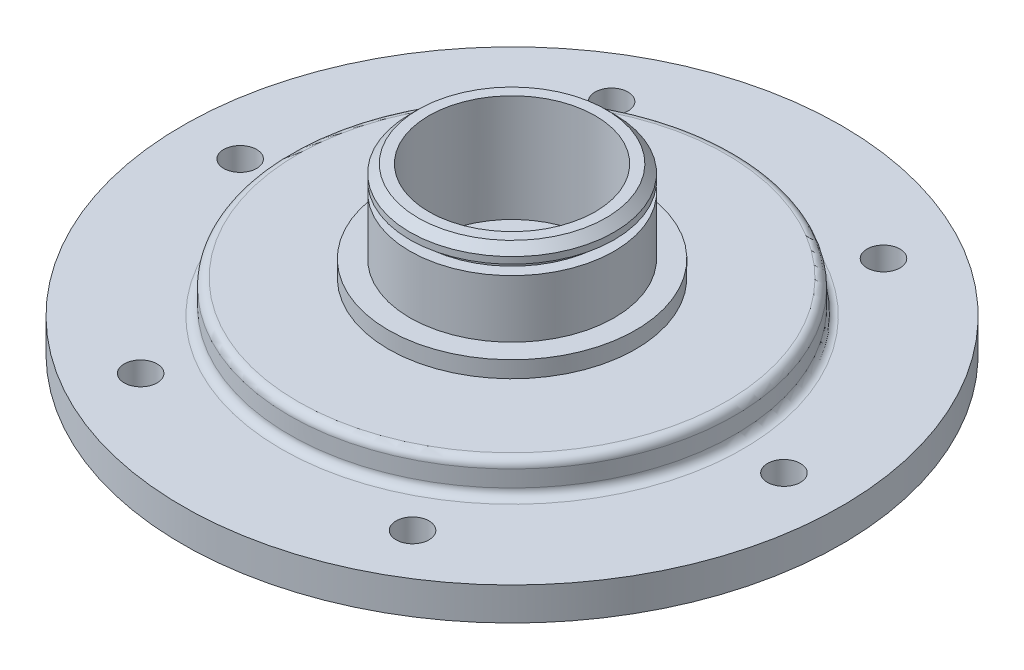
ISO-10303-21;
HEADER;
FILE_DESCRIPTION(('STEP AP214'),'2;1');
FILE_NAME('part.step','',(''),(''),'','','');
FILE_SCHEMA(('AUTOMOTIVE_DESIGN { 1 0 10303 214 1 1 1 1 }'));
ENDSEC;
DATA;
#1=APPLICATION_CONTEXT('core data for automotive mechanical design processes');
#2=APPLICATION_PROTOCOL_DEFINITION('international standard','automotive_design',2000,#1);
#3=PRODUCT_CONTEXT('',#1,'mechanical');
#4=PRODUCT('Part','Part','',(#3));
#5=PRODUCT_RELATED_PRODUCT_CATEGORY('part','',(#4));
#6=PRODUCT_DEFINITION_FORMATION('','',#4);
#7=PRODUCT_DEFINITION_CONTEXT('part definition',#1,'design');
#8=PRODUCT_DEFINITION('design','',#6,#7);
#9=PRODUCT_DEFINITION_SHAPE('','',#8);
#10=(LENGTH_UNIT() NAMED_UNIT(*) SI_UNIT(.MILLI.,.METRE.));
#11=(NAMED_UNIT(*) PLANE_ANGLE_UNIT() SI_UNIT($,.RADIAN.));
#12=(NAMED_UNIT(*) SI_UNIT($,.STERADIAN.) SOLID_ANGLE_UNIT());
#13=UNCERTAINTY_MEASURE_WITH_UNIT(LENGTH_MEASURE(1.E-05),#10,'distance_accuracy_value','');
#14=(GEOMETRIC_REPRESENTATION_CONTEXT(3) GLOBAL_UNCERTAINTY_ASSIGNED_CONTEXT((#13)) GLOBAL_UNIT_ASSIGNED_CONTEXT((#10,
#11,#12)) REPRESENTATION_CONTEXT('',''));
#15=CARTESIAN_POINT('',(0.,0.,0.));
#16=DIRECTION('',(0.,0.,1.));
#17=DIRECTION('',(1.,0.,0.));
#18=AXIS2_PLACEMENT_3D('',#15,#16,#17);
#19=CARTESIAN_POINT('',(0.,10.,0.));
#20=DIRECTION('',(0.,-1.,0.));
#21=DIRECTION('',(0.,0.,-1.));
#22=AXIS2_PLACEMENT_3D('',#19,#20,#21);
#23=CYLINDRICAL_SURFACE('',#22,10.1);
#24=CARTESIAN_POINT('',(0.,10.,0.));
#25=DIRECTION('',(0.,1.,0.));
#26=DIRECTION('',(0.,0.,1.));
#27=AXIS2_PLACEMENT_3D('',#24,#25,#26);
#28=CIRCLE('',#27,10.1);
#29=CARTESIAN_POINT('',(0.,10.,10.1));
#30=VERTEX_POINT('',#29);
#31=EDGE_CURVE('E83',#30,#30,#28,.T.);
#32=ORIENTED_EDGE('',*,*,#31,.T.);
#33=EDGE_LOOP('',(#32));
#34=FACE_BOUND('',#33,.T.);
#35=CARTESIAN_POINT('',(0.,-3.,0.));
#36=DIRECTION('',(0.,-1.,0.));
#37=DIRECTION('',(0.,0.,-1.));
#38=AXIS2_PLACEMENT_3D('',#35,#36,#37);
#39=CIRCLE('',#38,10.1);
#40=CARTESIAN_POINT('',(0.,-3.,-10.1));
#41=VERTEX_POINT('',#40);
#42=EDGE_CURVE('E68',#41,#41,#39,.T.);
#43=ORIENTED_EDGE('',*,*,#42,.T.);
#44=EDGE_LOOP('',(#43));
#45=FACE_BOUND('',#44,.T.);
#46=ADVANCED_FACE('F43',(#34,#45),#23,.F.);
#47=CARTESIAN_POINT('',(0.,10.,0.));
#48=DIRECTION('',(0.,-1.,0.));
#49=DIRECTION('',(0.,0.,-1.));
#50=AXIS2_PLACEMENT_3D('',#47,#48,#49);
#51=CYLINDRICAL_SURFACE('',#50,12.4);
#52=CARTESIAN_POINT('',(0.,0.,0.));
#53=DIRECTION('',(0.,1.,0.));
#54=DIRECTION('',(0.,0.,1.));
#55=AXIS2_PLACEMENT_3D('',#52,#53,#54);
#56=CIRCLE('',#55,12.4);
#57=CARTESIAN_POINT('',(0.,0.,12.4));
#58=VERTEX_POINT('',#57);
#59=EDGE_CURVE('E84',#58,#58,#56,.T.);
#60=ORIENTED_EDGE('',*,*,#59,.T.);
#61=EDGE_LOOP('',(#60));
#62=FACE_BOUND('',#61,.T.);
#63=CARTESIAN_POINT('',(0.,7.,0.));
#64=DIRECTION('',(0.,1.,0.));
#65=DIRECTION('',(0.,0.,1.));
#66=AXIS2_PLACEMENT_3D('',#63,#64,#65);
#67=CIRCLE('',#66,12.4);
#68=CARTESIAN_POINT('',(0.,7.,12.4));
#69=VERTEX_POINT('',#68);
#70=EDGE_CURVE('E135',#69,#69,#67,.T.);
#71=ORIENTED_EDGE('',*,*,#70,.F.);
#72=EDGE_LOOP('',(#71));
#73=FACE_BOUND('',#72,.T.);
#74=ADVANCED_FACE('F181',(#62,#73),#51,.T.);
#75=CARTESIAN_POINT('',(0.,10.,0.));
#76=DIRECTION('',(0.,1.,0.));
#77=DIRECTION('',(0.,0.,1.));
#78=AXIS2_PLACEMENT_3D('',#75,#76,#77);
#79=PLANE('',#78);
#80=CARTESIAN_POINT('',(0.,10.,0.));
#81=DIRECTION('',(0.,1.,0.));
#82=DIRECTION('',(0.,0.,1.));
#83=AXIS2_PLACEMENT_3D('',#80,#81,#82);
#84=CIRCLE('',#83,11.4);
#85=CARTESIAN_POINT('',(0.,10.,11.4));
#86=VERTEX_POINT('',#85);
#87=EDGE_CURVE('E80',#86,#86,#84,.T.);
#88=ORIENTED_EDGE('',*,*,#87,.T.);
#89=EDGE_LOOP('',(#88));
#90=FACE_BOUND('',#89,.T.);
#91=ORIENTED_EDGE('',*,*,#31,.F.);
#92=EDGE_LOOP('',(#91));
#93=FACE_BOUND('',#92,.T.);
#94=ADVANCED_FACE('F187',(#90,#93),#79,.T.);
#95=CARTESIAN_POINT('',(0.,9.00000000000001,0.));
#96=DIRECTION('',(0.,1.,0.));
#97=DIRECTION('',(0.,0.,1.));
#98=AXIS2_PLACEMENT_3D('',#95,#96,#97);
#99=CIRCLE('',#98,12.4);
#100=CARTESIAN_POINT('',(0.,9.00000000000001,12.4));
#101=VERTEX_POINT('',#100);
#102=EDGE_CURVE('E74',#101,#101,#99,.F.);
#103=ORIENTED_EDGE('',*,*,#102,.T.);
#104=EDGE_LOOP('',(#103));
#105=FACE_BOUND('',#104,.T.);
#106=CARTESIAN_POINT('',(0.,8.2,0.));
#107=DIRECTION('',(0.,1.,0.));
#108=DIRECTION('',(0.,0.,1.));
#109=AXIS2_PLACEMENT_3D('',#106,#107,#108);
#110=CIRCLE('',#109,12.4);
#111=CARTESIAN_POINT('',(0.,8.2,12.4));
#112=VERTEX_POINT('',#111);
#113=EDGE_CURVE('E132',#112,#112,#110,.T.);
#114=ORIENTED_EDGE('',*,*,#113,.T.);
#115=EDGE_LOOP('',(#114));
#116=FACE_BOUND('',#115,.T.);
#117=ADVANCED_FACE('F190',(#105,#116),#51,.T.);
#118=CARTESIAN_POINT('',(0.,0.,0.));
#119=DIRECTION('',(0.,-1.,0.));
#120=DIRECTION('',(0.,0.,-1.));
#121=AXIS2_PLACEMENT_3D('',#118,#119,#120);
#122=PLANE('',#121);
#123=ORIENTED_EDGE('',*,*,#59,.F.);
#124=EDGE_LOOP('',(#123));
#125=FACE_BOUND('',#124,.T.);
#126=CARTESIAN_POINT('',(0.,0.,0.));
#127=DIRECTION('',(0.,-1.,0.));
#128=DIRECTION('',(0.,0.,-1.));
#129=AXIS2_PLACEMENT_3D('',#126,#127,#128);
#130=CIRCLE('',#129,15.);
#131=CARTESIAN_POINT('',(0.,0.,-15.));
#132=VERTEX_POINT('',#131);
#133=EDGE_CURVE('E87',#132,#132,#130,.T.);
#134=ORIENTED_EDGE('',*,*,#133,.F.);
#135=EDGE_LOOP('',(#134));
#136=FACE_BOUND('',#135,.T.);
#137=ADVANCED_FACE('F200',(#125,#136),#122,.F.);
#138=CARTESIAN_POINT('',(0.,-6.,0.));
#139=DIRECTION('',(0.,1.,0.));
#140=DIRECTION('',(0.,0.,1.));
#141=AXIS2_PLACEMENT_3D('',#138,#139,#140);
#142=CYLINDRICAL_SURFACE('',#141,15.);
#143=CARTESIAN_POINT('',(0.,-2.,0.));
#144=DIRECTION('',(0.,1.,0.));
#145=DIRECTION('',(0.,0.,1.));
#146=AXIS2_PLACEMENT_3D('',#143,#144,#145);
#147=CIRCLE('',#146,15.);
#148=CARTESIAN_POINT('',(0.,-2.,15.));
#149=VERTEX_POINT('',#148);
#150=EDGE_CURVE('E67',#149,#149,#147,.T.);
#151=ORIENTED_EDGE('',*,*,#150,.T.);
#152=EDGE_LOOP('',(#151));
#153=FACE_BOUND('',#152,.T.);
#154=ORIENTED_EDGE('',*,*,#133,.T.);
#155=EDGE_LOOP('',(#154));
#156=FACE_BOUND('',#155,.T.);
#157=ADVANCED_FACE('F194',(#153,#156),#142,.T.);
#158=CARTESIAN_POINT('',(0.,-10.,0.));
#159=DIRECTION('',(0.,-1.,0.));
#160=DIRECTION('',(0.,0.,-1.));
#161=AXIS2_PLACEMENT_3D('',#158,#159,#160);
#162=PLANE('',#161);
#163=CARTESIAN_POINT('',(0.,-10.,0.));
#164=DIRECTION('',(0.,-1.,0.));
#165=DIRECTION('',(0.,0.,-1.));
#166=AXIS2_PLACEMENT_3D('',#163,#164,#165);
#167=CIRCLE('',#166,27.5);
#168=CARTESIAN_POINT('',(0.,-10.,-27.5));
#169=VERTEX_POINT('',#168);
#170=EDGE_CURVE('E71',#169,#169,#167,.F.);
#171=ORIENTED_EDGE('',*,*,#170,.T.);
#172=EDGE_LOOP('',(#171));
#173=FACE_BOUND('',#172,.T.);
#174=CARTESIAN_POINT('',(-16.5,-10.,28.5788383248865));
#175=DIRECTION('',(0.,-1.,0.));
#176=DIRECTION('',(0.,0.,-1.));
#177=AXIS2_PLACEMENT_3D('',#174,#175,#176);
#178=CIRCLE('',#177,2.);
#179=CARTESIAN_POINT('',(-16.5,-10.,26.5788383248865));
#180=VERTEX_POINT('',#179);
#181=EDGE_CURVE('E120',#180,#180,#178,.T.);
#182=ORIENTED_EDGE('',*,*,#181,.F.);
#183=EDGE_LOOP('',(#182));
#184=FACE_BOUND('',#183,.T.);
#185=CARTESIAN_POINT('',(-16.5,-10.,-28.5788383248865));
#186=DIRECTION('',(0.,-1.,0.));
#187=DIRECTION('',(0.,0.,-1.));
#188=AXIS2_PLACEMENT_3D('',#185,#186,#187);
#189=CIRCLE('',#188,2.00000000000001);
#190=CARTESIAN_POINT('',(-16.5,-10.,-30.5788383248865));
#191=VERTEX_POINT('',#190);
#192=EDGE_CURVE('E108',#191,#191,#189,.T.);
#193=ORIENTED_EDGE('',*,*,#192,.F.);
#194=EDGE_LOOP('',(#193));
#195=FACE_BOUND('',#194,.T.);
#196=CARTESIAN_POINT('',(33.,-10.,0.));
#197=DIRECTION('',(0.,-1.,0.));
#198=DIRECTION('',(0.,0.,-1.));
#199=AXIS2_PLACEMENT_3D('',#196,#197,#198);
#200=CIRCLE('',#199,2.);
#201=CARTESIAN_POINT('',(33.,-10.,-2.));
#202=VERTEX_POINT('',#201);
#203=EDGE_CURVE('E96',#202,#202,#200,.T.);
#204=ORIENTED_EDGE('',*,*,#203,.F.);
#205=EDGE_LOOP('',(#204));
#206=FACE_BOUND('',#205,.T.);
#207=CARTESIAN_POINT('',(0.,-10.,0.));
#208=DIRECTION('',(0.,-1.,0.));
#209=DIRECTION('',(0.,0.,-1.));
#210=AXIS2_PLACEMENT_3D('',#207,#208,#209);
#211=CIRCLE('',#210,40.);
#212=CARTESIAN_POINT('',(0.,-10.,-40.));
#213=VERTEX_POINT('',#212);
#214=EDGE_CURVE('E92',#213,#213,#211,.T.);
#215=ORIENTED_EDGE('',*,*,#214,.T.);
#216=EDGE_LOOP('',(#215));
#217=FACE_BOUND('',#216,.T.);
#218=CARTESIAN_POINT('',(16.5,-10.,-28.5788383248865));
#219=DIRECTION('',(0.,-1.,0.));
#220=DIRECTION('',(0.,0.,-1.));
#221=AXIS2_PLACEMENT_3D('',#218,#219,#220);
#222=CIRCLE('',#221,2.00000000000001);
#223=CARTESIAN_POINT('',(16.5,-10.,-30.5788383248865));
#224=VERTEX_POINT('',#223);
#225=EDGE_CURVE('E102',#224,#224,#222,.T.);
#226=ORIENTED_EDGE('',*,*,#225,.F.);
#227=EDGE_LOOP('',(#226));
#228=FACE_BOUND('',#227,.T.);
#229=CARTESIAN_POINT('',(-33.,-10.,0.));
#230=DIRECTION('',(0.,-1.,0.));
#231=DIRECTION('',(0.,0.,-1.));
#232=AXIS2_PLACEMENT_3D('',#229,#230,#231);
#233=CIRCLE('',#232,2.);
#234=CARTESIAN_POINT('',(-33.,-10.,-2.00000000000001));
#235=VERTEX_POINT('',#234);
#236=EDGE_CURVE('E114',#235,#235,#233,.T.);
#237=ORIENTED_EDGE('',*,*,#236,.F.);
#238=EDGE_LOOP('',(#237));
#239=FACE_BOUND('',#238,.T.);
#240=CARTESIAN_POINT('',(16.5,-10.,28.5788383248865));
#241=DIRECTION('',(0.,-1.,0.));
#242=DIRECTION('',(0.,0.,-1.));
#243=AXIS2_PLACEMENT_3D('',#240,#241,#242);
#244=CIRCLE('',#243,2.00000000000001);
#245=CARTESIAN_POINT('',(16.5,-10.,26.5788383248865));
#246=VERTEX_POINT('',#245);
#247=EDGE_CURVE('E126',#246,#246,#244,.T.);
#248=ORIENTED_EDGE('',*,*,#247,.F.);
#249=EDGE_LOOP('',(#248));
#250=FACE_BOUND('',#249,.T.);
#251=ADVANCED_FACE('F228',(#173,#184,#195,#206,#217,#228,#239,#250),#162,.T.);
#252=CARTESIAN_POINT('',(0.,-6.,0.));
#253=DIRECTION('',(0.,-1.,0.));
#254=DIRECTION('',(0.,0.,-1.));
#255=AXIS2_PLACEMENT_3D('',#252,#253,#254);
#256=PLANE('',#255);
#257=CARTESIAN_POINT('',(0.,-6.,0.));
#258=DIRECTION('',(0.,-1.,0.));
#259=DIRECTION('',(0.,0.,-1.));
#260=AXIS2_PLACEMENT_3D('',#257,#258,#259);
#261=CIRCLE('',#260,28.);
#262=CARTESIAN_POINT('',(0.,-6.,-28.));
#263=VERTEX_POINT('',#262);
#264=EDGE_CURVE('E10',#263,#263,#261,.T.);
#265=ORIENTED_EDGE('',*,*,#264,.T.);
#266=EDGE_LOOP('',(#265));
#267=FACE_BOUND('',#266,.T.);
#268=CARTESIAN_POINT('',(0.,-6.,0.));
#269=DIRECTION('',(0.,-1.,0.));
#270=DIRECTION('',(0.,0.,-1.));
#271=AXIS2_PLACEMENT_3D('',#268,#269,#270);
#272=CIRCLE('',#271,40.);
#273=CARTESIAN_POINT('',(0.,-6.,-40.));
#274=VERTEX_POINT('',#273);
#275=EDGE_CURVE('E93',#274,#274,#272,.T.);
#276=ORIENTED_EDGE('',*,*,#275,.F.);
#277=EDGE_LOOP('',(#276));
#278=FACE_BOUND('',#277,.T.);
#279=CARTESIAN_POINT('',(33.,-6.,0.));
#280=DIRECTION('',(0.,-1.,0.));
#281=DIRECTION('',(0.,0.,-1.));
#282=AXIS2_PLACEMENT_3D('',#279,#280,#281);
#283=CIRCLE('',#282,2.);
#284=CARTESIAN_POINT('',(33.,-6.,-2.));
#285=VERTEX_POINT('',#284);
#286=EDGE_CURVE('E99',#285,#285,#283,.T.);
#287=ORIENTED_EDGE('',*,*,#286,.T.);
#288=EDGE_LOOP('',(#287));
#289=FACE_BOUND('',#288,.T.);
#290=CARTESIAN_POINT('',(16.5,-6.,-28.5788383248865));
#291=DIRECTION('',(0.,-1.,0.));
#292=DIRECTION('',(0.,0.,-1.));
#293=AXIS2_PLACEMENT_3D('',#290,#291,#292);
#294=CIRCLE('',#293,2.00000000000001);
#295=CARTESIAN_POINT('',(16.5,-6.,-30.5788383248865));
#296=VERTEX_POINT('',#295);
#297=EDGE_CURVE('E105',#296,#296,#294,.T.);
#298=ORIENTED_EDGE('',*,*,#297,.T.);
#299=EDGE_LOOP('',(#298));
#300=FACE_BOUND('',#299,.T.);
#301=CARTESIAN_POINT('',(-16.5,-6.,-28.5788383248865));
#302=DIRECTION('',(0.,-1.,0.));
#303=DIRECTION('',(0.,0.,-1.));
#304=AXIS2_PLACEMENT_3D('',#301,#302,#303);
#305=CIRCLE('',#304,2.00000000000001);
#306=CARTESIAN_POINT('',(-16.5,-6.,-30.5788383248865));
#307=VERTEX_POINT('',#306);
#308=EDGE_CURVE('E111',#307,#307,#305,.T.);
#309=ORIENTED_EDGE('',*,*,#308,.T.);
#310=EDGE_LOOP('',(#309));
#311=FACE_BOUND('',#310,.T.);
#312=CARTESIAN_POINT('',(-33.,-6.,0.));
#313=DIRECTION('',(0.,-1.,0.));
#314=DIRECTION('',(0.,0.,-1.));
#315=AXIS2_PLACEMENT_3D('',#312,#313,#314);
#316=CIRCLE('',#315,2.);
#317=CARTESIAN_POINT('',(-33.,-6.,-2.00000000000001));
#318=VERTEX_POINT('',#317);
#319=EDGE_CURVE('E117',#318,#318,#316,.T.);
#320=ORIENTED_EDGE('',*,*,#319,.T.);
#321=EDGE_LOOP('',(#320));
#322=FACE_BOUND('',#321,.T.);
#323=CARTESIAN_POINT('',(-16.5,-6.,28.5788383248865));
#324=DIRECTION('',(0.,-1.,0.));
#325=DIRECTION('',(0.,0.,-1.));
#326=AXIS2_PLACEMENT_3D('',#323,#324,#325);
#327=CIRCLE('',#326,2.);
#328=CARTESIAN_POINT('',(-16.5,-6.,26.5788383248865));
#329=VERTEX_POINT('',#328);
#330=EDGE_CURVE('E123',#329,#329,#327,.T.);
#331=ORIENTED_EDGE('',*,*,#330,.T.);
#332=EDGE_LOOP('',(#331));
#333=FACE_BOUND('',#332,.T.);
#334=CARTESIAN_POINT('',(16.5,-6.,28.5788383248865));
#335=DIRECTION('',(0.,-1.,0.));
#336=DIRECTION('',(0.,0.,-1.));
#337=AXIS2_PLACEMENT_3D('',#334,#335,#336);
#338=CIRCLE('',#337,2.00000000000001);
#339=CARTESIAN_POINT('',(16.5,-6.,26.5788383248865));
#340=VERTEX_POINT('',#339);
#341=EDGE_CURVE('E129',#340,#340,#338,.T.);
#342=ORIENTED_EDGE('',*,*,#341,.T.);
#343=EDGE_LOOP('',(#342));
#344=FACE_BOUND('',#343,.T.);
#345=ADVANCED_FACE('F241',(#267,#278,#289,#300,#311,#322,#333,#344),#256,.F.);
#346=CARTESIAN_POINT('',(0.,-10.,0.));
#347=DIRECTION('',(0.,1.,0.));
#348=DIRECTION('',(0.,0.,1.));
#349=AXIS2_PLACEMENT_3D('',#346,#347,#348);
#350=CYLINDRICAL_SURFACE('',#349,40.);
#351=ORIENTED_EDGE('',*,*,#214,.F.);
#352=EDGE_LOOP('',(#351));
#353=FACE_BOUND('',#352,.T.);
#354=ORIENTED_EDGE('',*,*,#275,.T.);
#355=EDGE_LOOP('',(#354));
#356=FACE_BOUND('',#355,.T.);
#357=ADVANCED_FACE('F237',(#353,#356),#350,.T.);
#358=CARTESIAN_POINT('',(33.,-10.,0.));
#359=DIRECTION('',(0.,1.,0.));
#360=DIRECTION('',(0.,0.,1.));
#361=AXIS2_PLACEMENT_3D('',#358,#359,#360);
#362=CYLINDRICAL_SURFACE('',#361,2.);
#363=ORIENTED_EDGE('',*,*,#203,.T.);
#364=EDGE_LOOP('',(#363));
#365=FACE_BOUND('',#364,.T.);
#366=ORIENTED_EDGE('',*,*,#286,.F.);
#367=EDGE_LOOP('',(#366));
#368=FACE_BOUND('',#367,.T.);
#369=ADVANCED_FACE('F240',(#365,#368),#362,.F.);
#370=CARTESIAN_POINT('',(16.5,-10.,-28.5788383248865));
#371=DIRECTION('',(0.,1.,0.));
#372=DIRECTION('',(0.,0.,1.));
#373=AXIS2_PLACEMENT_3D('',#370,#371,#372);
#374=CYLINDRICAL_SURFACE('',#373,2.00000000000001);
#375=ORIENTED_EDGE('',*,*,#225,.T.);
#376=EDGE_LOOP('',(#375));
#377=FACE_BOUND('',#376,.T.);
#378=ORIENTED_EDGE('',*,*,#297,.F.);
#379=EDGE_LOOP('',(#378));
#380=FACE_BOUND('',#379,.T.);
#381=ADVANCED_FACE('F250',(#377,#380),#374,.F.);
#382=CARTESIAN_POINT('',(-16.5,-10.,-28.5788383248865));
#383=DIRECTION('',(0.,1.,0.));
#384=DIRECTION('',(0.,0.,1.));
#385=AXIS2_PLACEMENT_3D('',#382,#383,#384);
#386=CYLINDRICAL_SURFACE('',#385,2.00000000000001);
#387=ORIENTED_EDGE('',*,*,#192,.T.);
#388=EDGE_LOOP('',(#387));
#389=FACE_BOUND('',#388,.T.);
#390=ORIENTED_EDGE('',*,*,#308,.F.);
#391=EDGE_LOOP('',(#390));
#392=FACE_BOUND('',#391,.T.);
#393=ADVANCED_FACE('F254',(#389,#392),#386,.F.);
#394=CARTESIAN_POINT('',(-33.,-10.,0.));
#395=DIRECTION('',(0.,1.,0.));
#396=DIRECTION('',(0.,0.,1.));
#397=AXIS2_PLACEMENT_3D('',#394,#395,#396);
#398=CYLINDRICAL_SURFACE('',#397,2.);
#399=ORIENTED_EDGE('',*,*,#236,.T.);
#400=EDGE_LOOP('',(#399));
#401=FACE_BOUND('',#400,.T.);
#402=ORIENTED_EDGE('',*,*,#319,.F.);
#403=EDGE_LOOP('',(#402));
#404=FACE_BOUND('',#403,.T.);
#405=ADVANCED_FACE('F258',(#401,#404),#398,.F.);
#406=CARTESIAN_POINT('',(-16.5,-10.,28.5788383248865));
#407=DIRECTION('',(0.,1.,0.));
#408=DIRECTION('',(0.,0.,1.));
#409=AXIS2_PLACEMENT_3D('',#406,#407,#408);
#410=CYLINDRICAL_SURFACE('',#409,2.);
#411=ORIENTED_EDGE('',*,*,#181,.T.);
#412=EDGE_LOOP('',(#411));
#413=FACE_BOUND('',#412,.T.);
#414=ORIENTED_EDGE('',*,*,#330,.F.);
#415=EDGE_LOOP('',(#414));
#416=FACE_BOUND('',#415,.T.);
#417=ADVANCED_FACE('F262',(#413,#416),#410,.F.);
#418=CARTESIAN_POINT('',(16.5,-10.,28.5788383248865));
#419=DIRECTION('',(0.,1.,0.));
#420=DIRECTION('',(0.,0.,1.));
#421=AXIS2_PLACEMENT_3D('',#418,#419,#420);
#422=CYLINDRICAL_SURFACE('',#421,2.00000000000001);
#423=ORIENTED_EDGE('',*,*,#247,.T.);
#424=EDGE_LOOP('',(#423));
#425=FACE_BOUND('',#424,.T.);
#426=ORIENTED_EDGE('',*,*,#341,.F.);
#427=EDGE_LOOP('',(#426));
#428=FACE_BOUND('',#427,.T.);
#429=ADVANCED_FACE('F266',(#425,#428),#422,.F.);
#430=CARTESIAN_POINT('',(0.,8.2,0.));
#431=DIRECTION('',(0.,1.,0.));
#432=DIRECTION('',(0.,0.,1.));
#433=AXIS2_PLACEMENT_3D('',#430,#431,#432);
#434=PLANE('',#433);
#435=ORIENTED_EDGE('',*,*,#113,.F.);
#436=EDGE_LOOP('',(#435));
#437=FACE_BOUND('',#436,.T.);
#438=CARTESIAN_POINT('',(0.,8.2,0.));
#439=DIRECTION('',(0.,1.,0.));
#440=DIRECTION('',(0.,0.,1.));
#441=AXIS2_PLACEMENT_3D('',#438,#439,#440);
#442=CIRCLE('',#441,11.);
#443=CARTESIAN_POINT('',(0.,8.2,11.));
#444=VERTEX_POINT('',#443);
#445=EDGE_CURVE('E138',#444,#444,#442,.T.);
#446=ORIENTED_EDGE('',*,*,#445,.T.);
#447=EDGE_LOOP('',(#446));
#448=FACE_BOUND('',#447,.T.);
#449=ADVANCED_FACE('F270',(#437,#448),#434,.F.);
#450=CARTESIAN_POINT('',(0.,7.,0.));
#451=DIRECTION('',(0.,1.,0.));
#452=DIRECTION('',(0.,0.,1.));
#453=AXIS2_PLACEMENT_3D('',#450,#451,#452);
#454=PLANE('',#453);
#455=ORIENTED_EDGE('',*,*,#70,.T.);
#456=EDGE_LOOP('',(#455));
#457=FACE_BOUND('',#456,.T.);
#458=CARTESIAN_POINT('',(0.,7.,0.));
#459=DIRECTION('',(0.,1.,0.));
#460=DIRECTION('',(0.,0.,1.));
#461=AXIS2_PLACEMENT_3D('',#458,#459,#460);
#462=CIRCLE('',#461,11.);
#463=CARTESIAN_POINT('',(0.,7.,11.));
#464=VERTEX_POINT('',#463);
#465=EDGE_CURVE('E77',#464,#464,#462,.T.);
#466=ORIENTED_EDGE('',*,*,#465,.F.);
#467=EDGE_LOOP('',(#466));
#468=FACE_BOUND('',#467,.T.);
#469=ADVANCED_FACE('F272',(#457,#468),#454,.T.);
#470=CARTESIAN_POINT('',(0.,8.2,0.));
#471=DIRECTION('',(0.,-1.,0.));
#472=DIRECTION('',(0.,0.,-1.));
#473=AXIS2_PLACEMENT_3D('',#470,#471,#472);
#474=CYLINDRICAL_SURFACE('',#473,11.);
#475=ORIENTED_EDGE('',*,*,#445,.F.);
#476=EDGE_LOOP('',(#475));
#477=FACE_BOUND('',#476,.T.);
#478=ORIENTED_EDGE('',*,*,#465,.T.);
#479=EDGE_LOOP('',(#478));
#480=FACE_BOUND('',#479,.T.);
#481=ADVANCED_FACE('F208',(#477,#480),#474,.T.);
#482=CARTESIAN_POINT('',(0.,10.,0.));
#483=DIRECTION('',(0.,-1.,0.));
#484=DIRECTION('',(0.,0.,-1.));
#485=AXIS2_PLACEMENT_3D('',#482,#483,#484);
#486=CONICAL_SURFACE('',#485,11.4,0.78539816339744);
#487=ORIENTED_EDGE('',*,*,#102,.F.);
#488=EDGE_LOOP('',(#487));
#489=FACE_BOUND('',#488,.T.);
#490=ORIENTED_EDGE('',*,*,#87,.F.);
#491=EDGE_LOOP('',(#490));
#492=FACE_BOUND('',#491,.T.);
#493=ADVANCED_FACE('F203',(#489,#492),#486,.T.);
#494=CARTESIAN_POINT('',(0.,-2.,0.));
#495=DIRECTION('',(0.,1.,0.));
#496=DIRECTION('',(0.,0.,1.));
#497=AXIS2_PLACEMENT_3D('',#494,#495,#496);
#498=PLANE('',#497);
#499=CARTESIAN_POINT('',(0.,-2.,0.));
#500=DIRECTION('',(0.,1.,0.));
#501=DIRECTION('',(0.,0.,1.));
#502=AXIS2_PLACEMENT_3D('',#499,#500,#501);
#503=CIRCLE('',#502,26.);
#504=CARTESIAN_POINT('',(0.,-2.,26.));
#505=VERTEX_POINT('',#504);
#506=EDGE_CURVE('E58',#505,#505,#503,.T.);
#507=ORIENTED_EDGE('',*,*,#506,.T.);
#508=EDGE_LOOP('',(#507));
#509=FACE_BOUND('',#508,.T.);
#510=ORIENTED_EDGE('',*,*,#150,.F.);
#511=EDGE_LOOP('',(#510));
#512=FACE_BOUND('',#511,.T.);
#513=ADVANCED_FACE('F176',(#509,#512),#498,.T.);
#514=CARTESIAN_POINT('',(0.,-2.,0.));
#515=DIRECTION('',(0.,-1.,0.));
#516=DIRECTION('',(0.,0.,-1.));
#517=AXIS2_PLACEMENT_3D('',#514,#515,#516);
#518=CYLINDRICAL_SURFACE('',#517,27.);
#519=CARTESIAN_POINT('',(0.,-3.,0.));
#520=DIRECTION('',(0.,1.,0.));
#521=DIRECTION('',(0.,0.,1.));
#522=AXIS2_PLACEMENT_3D('',#519,#520,#521);
#523=CIRCLE('',#522,27.);
#524=CARTESIAN_POINT('',(0.,-3.,27.));
#525=VERTEX_POINT('',#524);
#526=EDGE_CURVE('E50',#525,#525,#523,.F.);
#527=ORIENTED_EDGE('',*,*,#526,.T.);
#528=EDGE_LOOP('',(#527));
#529=FACE_BOUND('',#528,.T.);
#530=CARTESIAN_POINT('',(0.,-5.,0.));
#531=DIRECTION('',(0.,-1.,0.));
#532=DIRECTION('',(0.,0.,-1.));
#533=AXIS2_PLACEMENT_3D('',#530,#531,#532);
#534=CIRCLE('',#533,27.);
#535=CARTESIAN_POINT('',(0.,-5.,-27.));
#536=VERTEX_POINT('',#535);
#537=EDGE_CURVE('E54',#536,#536,#534,.F.);
#538=ORIENTED_EDGE('',*,*,#537,.T.);
#539=EDGE_LOOP('',(#538));
#540=FACE_BOUND('',#539,.T.);
#541=ADVANCED_FACE('F166',(#529,#540),#518,.T.);
#542=CARTESIAN_POINT('',(0.,-5.,0.));
#543=DIRECTION('',(0.,-1.,0.));
#544=DIRECTION('',(0.,0.,-1.));
#545=AXIS2_PLACEMENT_3D('',#542,#543,#544);
#546=PLANE('',#545);
#547=CARTESIAN_POINT('',(0.,-5.,0.));
#548=DIRECTION('',(0.,-1.,0.));
#549=DIRECTION('',(0.,0.,-1.));
#550=AXIS2_PLACEMENT_3D('',#547,#548,#549);
#551=CIRCLE('',#550,22.5);
#552=CARTESIAN_POINT('',(0.,-5.,-22.5));
#553=VERTEX_POINT('',#552);
#554=EDGE_CURVE('E63',#553,#553,#551,.T.);
#555=ORIENTED_EDGE('',*,*,#554,.T.);
#556=EDGE_LOOP('',(#555));
#557=FACE_BOUND('',#556,.T.);
#558=CARTESIAN_POINT('',(0.,-5.,0.));
#559=DIRECTION('',(0.,-1.,0.));
#560=DIRECTION('',(0.,0.,-1.));
#561=AXIS2_PLACEMENT_3D('',#558,#559,#560);
#562=CIRCLE('',#561,8.);
#563=CARTESIAN_POINT('',(0.,-5.,-8.));
#564=VERTEX_POINT('',#563);
#565=EDGE_CURVE('E148',#564,#564,#562,.T.);
#566=ORIENTED_EDGE('',*,*,#565,.F.);
#567=EDGE_LOOP('',(#566));
#568=FACE_BOUND('',#567,.T.);
#569=ADVANCED_FACE('F163',(#557,#568),#546,.T.);
#570=CARTESIAN_POINT('',(0.,-7.5,0.));
#571=DIRECTION('',(0.,-1.,0.));
#572=DIRECTION('',(0.,0.,-1.));
#573=AXIS2_PLACEMENT_3D('',#570,#571,#572);
#574=TOROIDAL_SURFACE('',#573,22.5,2.5);
#575=ORIENTED_EDGE('',*,*,#554,.F.);
#576=EDGE_LOOP('',(#575));
#577=FACE_BOUND('',#576,.T.);
#578=CARTESIAN_POINT('',(0.,-7.5,0.));
#579=DIRECTION('',(0.,-1.,0.));
#580=DIRECTION('',(0.,0.,-1.));
#581=AXIS2_PLACEMENT_3D('',#578,#579,#580);
#582=CIRCLE('',#581,25.);
#583=CARTESIAN_POINT('',(0.,-7.5,-25.));
#584=VERTEX_POINT('',#583);
#585=EDGE_CURVE('E64',#584,#584,#582,.F.);
#586=ORIENTED_EDGE('',*,*,#585,.F.);
#587=EDGE_LOOP('',(#586));
#588=FACE_BOUND('',#587,.T.);
#589=ADVANCED_FACE('F165',(#577,#588),#574,.F.);
#590=CARTESIAN_POINT('',(0.,-7.5,0.));
#591=DIRECTION('',(0.,-1.,0.));
#592=DIRECTION('',(0.,0.,-1.));
#593=AXIS2_PLACEMENT_3D('',#590,#591,#592);
#594=TOROIDAL_SURFACE('',#593,27.5,2.5);
#595=ORIENTED_EDGE('',*,*,#170,.F.);
#596=EDGE_LOOP('',(#595));
#597=FACE_BOUND('',#596,.T.);
#598=ORIENTED_EDGE('',*,*,#585,.T.);
#599=EDGE_LOOP('',(#598));
#600=FACE_BOUND('',#599,.T.);
#601=ADVANCED_FACE('F173',(#597,#600),#594,.T.);
#602=CARTESIAN_POINT('',(0.,-3.,0.));
#603=DIRECTION('',(0.,1.,0.));
#604=DIRECTION('',(0.,0.,1.));
#605=AXIS2_PLACEMENT_3D('',#602,#603,#604);
#606=TOROIDAL_SURFACE('',#605,26.,1.);
#607=ORIENTED_EDGE('',*,*,#526,.F.);
#608=EDGE_LOOP('',(#607));
#609=FACE_BOUND('',#608,.T.);
#610=ORIENTED_EDGE('',*,*,#506,.F.);
#611=EDGE_LOOP('',(#610));
#612=FACE_BOUND('',#611,.T.);
#613=ADVANCED_FACE('F211',(#609,#612),#606,.T.);
#614=CARTESIAN_POINT('',(0.,-5.,0.));
#615=DIRECTION('',(0.,-1.,0.));
#616=DIRECTION('',(0.,0.,-1.));
#617=AXIS2_PLACEMENT_3D('',#614,#615,#616);
#618=TOROIDAL_SURFACE('',#617,28.,1.);
#619=ORIENTED_EDGE('',*,*,#264,.F.);
#620=EDGE_LOOP('',(#619));
#621=FACE_BOUND('',#620,.T.);
#622=ORIENTED_EDGE('',*,*,#537,.F.);
#623=EDGE_LOOP('',(#622));
#624=FACE_BOUND('',#623,.T.);
#625=ADVANCED_FACE('F45',(#621,#624),#618,.F.);
#626=CARTESIAN_POINT('',(0.,-3.,0.));
#627=DIRECTION('',(0.,-1.,0.));
#628=DIRECTION('',(0.,0.,-1.));
#629=AXIS2_PLACEMENT_3D('',#626,#627,#628);
#630=PLANE('',#629);
#631=CARTESIAN_POINT('',(0.,-3.,0.));
#632=DIRECTION('',(0.,-1.,0.));
#633=DIRECTION('',(0.,0.,-1.));
#634=AXIS2_PLACEMENT_3D('',#631,#632,#633);
#635=CIRCLE('',#634,8.);
#636=CARTESIAN_POINT('',(0.,-3.,-8.));
#637=VERTEX_POINT('',#636);
#638=EDGE_CURVE('E147',#637,#637,#635,.T.);
#639=ORIENTED_EDGE('',*,*,#638,.T.);
#640=EDGE_LOOP('',(#639));
#641=FACE_BOUND('',#640,.T.);
#642=ORIENTED_EDGE('',*,*,#42,.F.);
#643=EDGE_LOOP('',(#642));
#644=FACE_BOUND('',#643,.T.);
#645=ADVANCED_FACE('F154',(#641,#644),#630,.F.);
#646=CARTESIAN_POINT('',(0.,-3.,0.));
#647=DIRECTION('',(0.,-1.,0.));
#648=DIRECTION('',(0.,0.,-1.));
#649=AXIS2_PLACEMENT_3D('',#646,#647,#648);
#650=CYLINDRICAL_SURFACE('',#649,8.);
#651=ORIENTED_EDGE('',*,*,#638,.F.);
#652=EDGE_LOOP('',(#651));
#653=FACE_BOUND('',#652,.T.);
#654=ORIENTED_EDGE('',*,*,#565,.T.);
#655=EDGE_LOOP('',(#654));
#656=FACE_BOUND('',#655,.T.);
#657=ADVANCED_FACE('F157',(#653,#656),#650,.F.);
#658=CLOSED_SHELL('',(#46,#74,#94,#117,#137,#157,#251,#345,#357,#369,#381,#393,#405,#417,#429,
#449,#469,#481,#493,#513,#541,#569,#589,#601,#613,#625,#645,#657));
#659=MANIFOLD_SOLID_BREP('B2',#658);
#660=ADVANCED_BREP_SHAPE_REPRESENTATION('',(#18,#659),#14);
#661=SHAPE_DEFINITION_REPRESENTATION(#9,#660);
ENDSEC;
END-ISO-10303-21;
